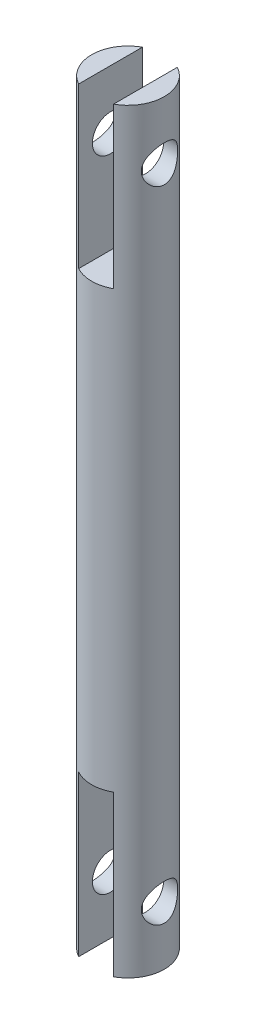
ISO-10303-21;
HEADER;
FILE_DESCRIPTION(('STEP AP214'),'2;1');
FILE_NAME('part.step','',(''),(''),'','','');
FILE_SCHEMA(('AUTOMOTIVE_DESIGN { 1 0 10303 214 1 1 1 1 }'));
ENDSEC;
DATA;
#1=APPLICATION_CONTEXT('core data for automotive mechanical design processes');
#2=APPLICATION_PROTOCOL_DEFINITION('international standard','automotive_design',2000,#1);
#3=PRODUCT_CONTEXT('',#1,'mechanical');
#4=PRODUCT('Part','Part','',(#3));
#5=PRODUCT_RELATED_PRODUCT_CATEGORY('part','',(#4));
#6=PRODUCT_DEFINITION_FORMATION('','',#4);
#7=PRODUCT_DEFINITION_CONTEXT('part definition',#1,'design');
#8=PRODUCT_DEFINITION('design','',#6,#7);
#9=PRODUCT_DEFINITION_SHAPE('','',#8);
#10=(LENGTH_UNIT() NAMED_UNIT(*) SI_UNIT(.MILLI.,.METRE.));
#11=(NAMED_UNIT(*) PLANE_ANGLE_UNIT() SI_UNIT($,.RADIAN.));
#12=(NAMED_UNIT(*) SI_UNIT($,.STERADIAN.) SOLID_ANGLE_UNIT());
#13=UNCERTAINTY_MEASURE_WITH_UNIT(LENGTH_MEASURE(1.E-05),#10,'distance_accuracy_value','');
#14=(GEOMETRIC_REPRESENTATION_CONTEXT(3) GLOBAL_UNCERTAINTY_ASSIGNED_CONTEXT((#13)) GLOBAL_UNIT_ASSIGNED_CONTEXT((#10,
#11,#12)) REPRESENTATION_CONTEXT('',''));
#15=CARTESIAN_POINT('',(0.,0.,0.));
#16=DIRECTION('',(0.,0.,1.));
#17=DIRECTION('',(1.,0.,0.));
#18=AXIS2_PLACEMENT_3D('',#15,#16,#17);
#19=CARTESIAN_POINT('',(0.,52.,0.));
#20=DIRECTION('',(0.,1.,0.));
#21=DIRECTION('',(0.,0.,1.));
#22=AXIS2_PLACEMENT_3D('',#19,#20,#21);
#23=PLANE('',#22);
#24=DIRECTION('',(0.,0.,1.));
#25=VECTOR('',#24,1.);
#26=CARTESIAN_POINT('',(-1.2,52.,-2.5));
#27=LINE('',#26,#25);
#28=CARTESIAN_POINT('',(-1.2,52.,-2.19317121994613));
#29=VERTEX_POINT('',#28);
#30=CARTESIAN_POINT('',(-1.2,52.,2.19317121994613));
#31=VERTEX_POINT('',#30);
#32=EDGE_CURVE('E122',#29,#31,#27,.T.);
#33=ORIENTED_EDGE('',*,*,#32,.F.);
#34=CARTESIAN_POINT('',(0.,52.,0.));
#35=DIRECTION('',(0.,1.,0.));
#36=DIRECTION('',(0.,0.,1.));
#37=AXIS2_PLACEMENT_3D('',#34,#35,#36);
#38=CIRCLE('',#37,2.5);
#39=EDGE_CURVE('E134',#29,#31,#38,.T.);
#40=ORIENTED_EDGE('',*,*,#39,.T.);
#41=EDGE_LOOP('',(#33,#40));
#42=FACE_BOUND('',#41,.T.);
#43=ADVANCED_FACE('F45',(#42),#23,.T.);
#44=CARTESIAN_POINT('',(-2.5,48.,0.));
#45=DIRECTION('',(1.,0.,0.));
#46=DIRECTION('',(0.,0.,-1.));
#47=AXIS2_PLACEMENT_3D('',#44,#45,#46);
#48=CYLINDRICAL_SURFACE('',#47,1.25);
#49=CARTESIAN_POINT('',(-1.2,48.,0.));
#50=DIRECTION('',(-1.,0.,0.));
#51=DIRECTION('',(0.,0.,1.));
#52=AXIS2_PLACEMENT_3D('',#49,#50,#51);
#53=CIRCLE('',#52,1.25);
#54=CARTESIAN_POINT('',(-1.2,48.,1.25));
#55=VERTEX_POINT('',#54);
#56=EDGE_CURVE('E227',#55,#55,#53,.F.);
#57=ORIENTED_EDGE('',*,*,#56,.T.);
#58=EDGE_LOOP('',(#57));
#59=FACE_BOUND('',#58,.T.);
#60=CARTESIAN_POINT('',(-2.5,46.75,0.));
#61=CARTESIAN_POINT('',(-2.49999641755189,46.7500041278994,-0.0657149536912329));
#62=CARTESIAN_POINT('',(-2.49738113774397,46.7552125914021,-0.131508249622541));
#63=CARTESIAN_POINT('',(-2.48717695046745,46.7758161004261,-0.261150294085531));
#64=CARTESIAN_POINT('',(-2.47957859786229,46.7912304912471,-0.324995108391879));
#65=CARTESIAN_POINT('',(-2.46020349254139,46.831492260771,-0.448666931100718));
#66=CARTESIAN_POINT('',(-2.448442989719,46.85630298031,-0.508508503673975));
#67=CARTESIAN_POINT('',(-2.42182220644723,46.9144632767062,-0.623090771008206));
#68=CARTESIAN_POINT('',(-2.40696217041913,46.9478121803111,-0.677831867487562));
#69=CARTESIAN_POINT('',(-2.37445322822571,47.0243965618566,-0.784384772202396));
#70=CARTESIAN_POINT('',(-2.3566899890942,47.0681080990496,-0.835819013902634));
#71=CARTESIAN_POINT('',(-2.32074962808431,47.1631518490588,-0.930974306083716));
#72=CARTESIAN_POINT('',(-2.30257220261294,47.2144898147155,-0.974689478883455));
#73=CARTESIAN_POINT('',(-2.26623688996684,47.3281041869042,-1.05656500056285));
#74=CARTESIAN_POINT('',(-2.24818983712665,47.3909201229324,-1.09403166943955));
#75=CARTESIAN_POINT('',(-2.21607473465401,47.5229591699828,-1.15771028361337));
#76=CARTESIAN_POINT('',(-2.20200384508737,47.5921776609034,-1.18393026870792));
#77=CARTESIAN_POINT('',(-2.18072333797261,47.7308313817774,-1.22266555273573));
#78=CARTESIAN_POINT('',(-2.17315339479642,47.8000055650842,-1.23590732135055));
#79=CARTESIAN_POINT('',(-2.1647736243566,47.9399735472244,-1.25053374163606));
#80=CARTESIAN_POINT('',(-2.1639571167911,48.0107656760889,-1.25193011046634));
#81=CARTESIAN_POINT('',(-2.16888662821561,48.1428575303942,-1.24335910896537));
#82=CARTESIAN_POINT('',(-2.17385954577517,48.2042800390288,-1.23473069942102));
#83=CARTESIAN_POINT('',(-2.18845285917313,48.3246523867163,-1.20867481132116));
#84=CARTESIAN_POINT('',(-2.1980747353972,48.3836014316316,-1.19124452987206));
#85=CARTESIAN_POINT('',(-2.22109345515926,48.4990364157071,-1.1477622254825));
#86=CARTESIAN_POINT('',(-2.23457300829998,48.5554329984822,-1.12151883389499));
#87=CARTESIAN_POINT('',(-2.26379255351755,48.6632928657375,-1.061302109585));
#88=CARTESIAN_POINT('',(-2.27953355975238,48.7147539195001,-1.02732530476558));
#89=CARTESIAN_POINT('',(-2.31391447379107,48.818151565929,-0.947582568640984));
#90=CARTESIAN_POINT('',(-2.33266887795933,48.8693210919702,-0.9008680729616));
#91=CARTESIAN_POINT('',(-2.36934529125509,48.9634192732386,-0.799444473426714));
#92=CARTESIAN_POINT('',(-2.38726689948501,49.0063439900424,-0.744731570717854));
#93=CARTESIAN_POINT('',(-2.42127484103705,49.0846070762872,-0.625645632289809));
#94=CARTESIAN_POINT('',(-2.43723730202509,49.1195005905572,-0.56094198949926));
#95=CARTESIAN_POINT('',(-2.46447351401553,49.1776212863038,-0.425582769360996));
#96=CARTESIAN_POINT('',(-2.47575098679441,49.200857731269,-0.354931970331595));
#97=CARTESIAN_POINT('',(-2.49155417176795,49.2330942546458,-0.215958114575876));
#98=CARTESIAN_POINT('',(-2.4965617287664,49.2431140446835,-0.147926913185405));
#99=CARTESIAN_POINT('',(-2.50091266823877,49.2518309139181,-0.0109744999366913));
#100=CARTESIAN_POINT('',(-2.5002587340164,49.2505333570493,0.0579462748373776));
#101=CARTESIAN_POINT('',(-2.49363990316801,49.2372416394766,0.189041214982493));
#102=CARTESIAN_POINT('',(-2.48809057110237,49.2260843340875,0.251324260062444));
#103=CARTESIAN_POINT('',(-2.47277714143524,49.1947024101311,0.373008615377397));
#104=CARTESIAN_POINT('',(-2.46301257917916,49.1744767919333,0.432409607113746));
#105=CARTESIAN_POINT('',(-2.43980314267087,49.1250019169585,0.548610760562083));
#106=CARTESIAN_POINT('',(-2.42626102212424,49.095511187354,0.605287996257694));
#107=CARTESIAN_POINT('',(-2.39679967896386,49.0286155804424,0.713076702123653));
#108=CARTESIAN_POINT('',(-2.38087944457231,48.9912073317582,0.764185787219102));
#109=CARTESIAN_POINT('',(-2.34635276671831,48.9052994683339,0.864709611613315));
#110=CARTESIAN_POINT('',(-2.32763606060552,48.856071414433,0.913465097280797));
#111=CARTESIAN_POINT('',(-2.29077989504843,48.7500935609134,1.00232040139155));
#112=CARTESIAN_POINT('',(-2.27264084226908,48.6933386014795,1.04241423211355));
#113=CARTESIAN_POINT('',(-2.23813990282585,48.5704454322496,1.11463489312212));
#114=CARTESIAN_POINT('',(-2.2219066207934,48.5039859172393,1.14628186984829));
#115=CARTESIAN_POINT('',(-2.19467590460158,48.3656124153843,1.19760353251725));
#116=CARTESIAN_POINT('',(-2.18367172800773,48.2937055918735,1.21729364485946));
#117=CARTESIAN_POINT('',(-2.16951876260834,48.1538622214232,1.2423271093121));
#118=CARTESIAN_POINT('',(-2.16571729325614,48.0862071832137,1.24886624550108));
#119=CARTESIAN_POINT('',(-2.16456693307719,47.9506911660366,1.25086144297598));
#120=CARTESIAN_POINT('',(-2.16721524534441,47.8828302890757,1.2463223082805));
#121=CARTESIAN_POINT('',(-2.17797327562531,47.755645623085,1.22740765699033));
#122=CARTESIAN_POINT('',(-2.18553868102992,47.6961244123195,1.2140103929285));
#123=CARTESIAN_POINT('',(-2.20463770234897,47.5802398507191,1.1789691977808));
#124=CARTESIAN_POINT('',(-2.21617259462095,47.523877522385,1.15732261394976));
#125=CARTESIAN_POINT('',(-2.2428566295566,47.4117189362667,1.10476968162585));
#126=CARTESIAN_POINT('',(-2.25819652995238,47.3562151227129,1.07333892227057));
#127=CARTESIAN_POINT('',(-2.29044164543238,47.2509068297743,1.00268871454579));
#128=CARTESIAN_POINT('',(-2.30734767243153,47.2011053368519,0.963465214048306));
#129=CARTESIAN_POINT('',(-2.34327903949141,47.102322522053,0.872754158330797));
#130=CARTESIAN_POINT('',(-2.36231229139336,47.0541761220476,0.820355528762708));
#131=CARTESIAN_POINT('',(-2.3984719031886,46.9671712707205,0.707693507775343));
#132=CARTESIAN_POINT('',(-2.4155972326005,46.9283178257171,0.647425904070976));
#133=CARTESIAN_POINT('',(-2.44622511981379,46.8609545465472,0.519914496024928));
#134=CARTESIAN_POINT('',(-2.45970120703636,46.8325197882357,0.452624379918262));
#135=CARTESIAN_POINT('',(-2.48126676704332,46.7877397901013,0.313427626617734));
#136=CARTESIAN_POINT('',(-2.48937154216165,46.771360191463,0.241534749528954));
#137=CARTESIAN_POINT('',(-2.49619327387079,46.7576282361552,0.140752433104227));
#138=CARTESIAN_POINT('',(-2.49761706674002,46.7547716989205,0.112702349299371));
#139=CARTESIAN_POINT('',(-2.49952121222331,46.750956668104,0.0564396647589457));
#140=CARTESIAN_POINT('',(-2.50000153879704,46.749998226911,0.0282270595592261));
#141=CARTESIAN_POINT('',(-2.5,46.75,0.));
#142=B_SPLINE_CURVE_WITH_KNOTS('',3,(#60,#61,#62,#63,#64,#65,#66,#67,#68,#69,#70,#71,#72,#73,
#74,#75,#76,#77,#78,#79,#80,#81,#82,#83,#84,#85,#86,#87,#88,#89,#90,#91,#92,#93,#94,#95,#96,#97,
#98,#99,#100,#101,#102,#103,#104,#105,#106,#107,#108,#109,#110,#111,#112,#113,#114,#115,#116,
#117,#118,#119,#120,#121,#122,#123,#124,#125,#126,#127,#128,#129,#130,#131,#132,#133,#134,#135,
#136,#137,#138,#139,#140,#141),.UNSPECIFIED.,.T.,.F.,(4,2,2,2,2,2,2,2,2,2,2,2,2,2,2,2,2,2,2,2,2,
2,2,2,2,2,2,2,2,2,2,2,2,2,2,2,2,2,2,2,4),(0.,0.197030321775365,0.394435187136497,
0.591077694365375,0.787704700726956,0.9962271983976,1.20490779706754,1.42977158038441,
1.65447434872851,1.86572515175287,2.07676696661275,2.2625714051165,2.44843504907097,
2.63862800210609,2.82890651575277,3.04331176667347,3.25781918248357,3.4822877776805,
3.70657771140349,3.91229113089181,4.11790705639344,4.30758633132651,4.49728652038664,
4.69241070034873,4.88761813435423,5.10199513305522,5.31651985769288,5.54143352699591,
5.76605639925971,5.96911634372966,6.17208824825005,6.35572412805227,6.53941910979597,
6.73545570969517,6.93159451423696,7.15156553440622,7.37165479220715,7.59330017078655,
7.81431135781161,7.8989410017212,7.98357298143557),.UNSPECIFIED.);
#143=CARTESIAN_POINT('',(-2.5,46.75,0.));
#144=VERTEX_POINT('',#143);
#145=EDGE_CURVE('E170',#144,#144,#142,.T.);
#146=ORIENTED_EDGE('',*,*,#145,.F.);
#147=EDGE_LOOP('',(#146));
#148=FACE_BOUND('',#147,.T.);
#149=ADVANCED_FACE('F183',(#59,#148),#48,.F.);
#150=CARTESIAN_POINT('',(0.,52.,0.));
#151=DIRECTION('',(0.,-1.,0.));
#152=DIRECTION('',(0.,0.,-1.));
#153=AXIS2_PLACEMENT_3D('',#150,#151,#152);
#154=CYLINDRICAL_SURFACE('',#153,2.5);
#155=CARTESIAN_POINT('',(0.,41.,0.));
#156=DIRECTION('',(0.,-1.,0.));
#157=DIRECTION('',(0.,0.,-1.));
#158=AXIS2_PLACEMENT_3D('',#155,#156,#157);
#159=CIRCLE('',#158,2.5);
#160=CARTESIAN_POINT('',(1.2,41.,2.19317121994613));
#161=VERTEX_POINT('',#160);
#162=CARTESIAN_POINT('',(-1.2,41.,2.19317121994613));
#163=VERTEX_POINT('',#162);
#164=EDGE_CURVE('E11',#161,#163,#159,.T.);
#165=ORIENTED_EDGE('',*,*,#164,.T.);
#166=DIRECTION('',(0.,-1.,0.));
#167=VECTOR('',#166,1.);
#168=CARTESIAN_POINT('',(-1.2,52.,2.19317121994613));
#169=LINE('',#168,#167);
#170=EDGE_CURVE('E223',#163,#31,#169,.F.);
#171=ORIENTED_EDGE('',*,*,#170,.T.);
#172=ORIENTED_EDGE('',*,*,#39,.F.);
#173=DIRECTION('',(0.,-1.,0.));
#174=VECTOR('',#173,1.);
#175=CARTESIAN_POINT('',(-1.2,52.,-2.19317121994613));
#176=LINE('',#175,#174);
#177=CARTESIAN_POINT('',(-1.2,41.,-2.19317121994613));
#178=VERTEX_POINT('',#177);
#179=EDGE_CURVE('E161',#29,#178,#176,.T.);
#180=ORIENTED_EDGE('',*,*,#179,.T.);
#181=CARTESIAN_POINT('',(1.2,41.,-2.19317121994613));
#182=VERTEX_POINT('',#181);
#183=EDGE_CURVE('E50',#178,#182,#159,.T.);
#184=ORIENTED_EDGE('',*,*,#183,.T.);
#185=DIRECTION('',(0.,-1.,0.));
#186=VECTOR('',#185,1.);
#187=CARTESIAN_POINT('',(1.2,52.,-2.19317121994613));
#188=LINE('',#187,#186);
#189=CARTESIAN_POINT('',(1.2,52.,-2.19317121994613));
#190=VERTEX_POINT('',#189);
#191=EDGE_CURVE('E115',#182,#190,#188,.F.);
#192=ORIENTED_EDGE('',*,*,#191,.T.);
#193=CARTESIAN_POINT('',(1.2,52.,2.19317121994613));
#194=VERTEX_POINT('',#193);
#195=EDGE_CURVE('E126',#194,#190,#38,.T.);
#196=ORIENTED_EDGE('',*,*,#195,.F.);
#197=DIRECTION('',(0.,-1.,0.));
#198=VECTOR('',#197,1.);
#199=CARTESIAN_POINT('',(1.2,52.,2.19317121994613));
#200=LINE('',#199,#198);
#201=EDGE_CURVE('E62',#194,#161,#200,.T.);
#202=ORIENTED_EDGE('',*,*,#201,.T.);
#203=EDGE_LOOP('',(#165,#171,#172,#180,#184,#192,#196,#202));
#204=FACE_BOUND('',#203,.T.);
#205=CARTESIAN_POINT('',(-2.5,2.75,0.));
#206=CARTESIAN_POINT('',(-2.49999641755189,2.75000412789938,-0.0657149536912331));
#207=CARTESIAN_POINT('',(-2.49738113774397,2.75521259140209,-0.131508249622541));
#208=CARTESIAN_POINT('',(-2.48717695046745,2.77581610042615,-0.261150294085532));
#209=CARTESIAN_POINT('',(-2.47957859786229,2.79123049124706,-0.32499510839188));
#210=CARTESIAN_POINT('',(-2.46020349254139,2.83149226077099,-0.448666931100718));
#211=CARTESIAN_POINT('',(-2.448442989719,2.85630298031002,-0.508508503673975));
#212=CARTESIAN_POINT('',(-2.42182220644723,2.91446327670618,-0.623090771008207));
#213=CARTESIAN_POINT('',(-2.40696217041912,2.94781218031107,-0.677831867487563));
#214=CARTESIAN_POINT('',(-2.37445322822571,3.02439656185662,-0.784384772202399));
#215=CARTESIAN_POINT('',(-2.3566899890942,3.06810809904955,-0.835819013902641));
#216=CARTESIAN_POINT('',(-2.3207496280843,3.16315184905879,-0.930974306083722));
#217=CARTESIAN_POINT('',(-2.30257220261294,3.21448981471555,-0.974689478883458));
#218=CARTESIAN_POINT('',(-2.26623688996684,3.32810418690423,-1.05656500056285));
#219=CARTESIAN_POINT('',(-2.24818983712665,3.39092012293239,-1.09403166943955));
#220=CARTESIAN_POINT('',(-2.21607473465401,3.52295916998277,-1.15771028361337));
#221=CARTESIAN_POINT('',(-2.20200384508737,3.59217766090344,-1.18393026870792));
#222=CARTESIAN_POINT('',(-2.18072333797261,3.7308313817774,-1.22266555273573));
#223=CARTESIAN_POINT('',(-2.17315339479642,3.80000556508424,-1.23590732135055));
#224=CARTESIAN_POINT('',(-2.1647736243566,3.93997354722434,-1.25053374163606));
#225=CARTESIAN_POINT('',(-2.1639571167911,4.01076567608894,-1.25193011046634));
#226=CARTESIAN_POINT('',(-2.16888662821561,4.14285753039421,-1.24335910896537));
#227=CARTESIAN_POINT('',(-2.17385954577517,4.20428003902881,-1.23473069942103));
#228=CARTESIAN_POINT('',(-2.18845285917313,4.3246523867163,-1.20867481132117));
#229=CARTESIAN_POINT('',(-2.1980747353972,4.38360143163164,-1.19124452987206));
#230=CARTESIAN_POINT('',(-2.22109345515926,4.49903641570707,-1.1477622254825));
#231=CARTESIAN_POINT('',(-2.23457300829998,4.55543299848223,-1.12151883389499));
#232=CARTESIAN_POINT('',(-2.26379255351755,4.66329286573751,-1.061302109585));
#233=CARTESIAN_POINT('',(-2.27953355975238,4.71475391950011,-1.02732530476558));
#234=CARTESIAN_POINT('',(-2.31391447379107,4.81815156592903,-0.947582568640986));
#235=CARTESIAN_POINT('',(-2.33266887795933,4.8693210919702,-0.900868072961602));
#236=CARTESIAN_POINT('',(-2.36934529125509,4.96341927323863,-0.799444473426716));
#237=CARTESIAN_POINT('',(-2.38726689948501,5.00634399004235,-0.744731570717856));
#238=CARTESIAN_POINT('',(-2.42127484103705,5.08460707628716,-0.625645632289809));
#239=CARTESIAN_POINT('',(-2.43723730202509,5.11950059055718,-0.56094198949926));
#240=CARTESIAN_POINT('',(-2.46447351401553,5.17762128630376,-0.425582769360995));
#241=CARTESIAN_POINT('',(-2.47575098679441,5.20085773126896,-0.354931970331594));
#242=CARTESIAN_POINT('',(-2.49155417176795,5.23309425464584,-0.215958114575876));
#243=CARTESIAN_POINT('',(-2.4965617287664,5.24311404468347,-0.147926913185404));
#244=CARTESIAN_POINT('',(-2.50091266823877,5.25183091391811,-0.0109744999366911));
#245=CARTESIAN_POINT('',(-2.5002587340164,5.25053335704935,0.0579462748373775));
#246=CARTESIAN_POINT('',(-2.49363990316801,5.23724163947656,0.189041214982492));
#247=CARTESIAN_POINT('',(-2.48809057110237,5.22608433408746,0.251324260062443));
#248=CARTESIAN_POINT('',(-2.47277714143524,5.19470241013114,0.373008615377396));
#249=CARTESIAN_POINT('',(-2.46301257917916,5.1744767919333,0.432409607113746));
#250=CARTESIAN_POINT('',(-2.43980314267087,5.12500191695853,0.548610760562081));
#251=CARTESIAN_POINT('',(-2.42626102212424,5.09551118735398,0.605287996257691));
#252=CARTESIAN_POINT('',(-2.39679967896386,5.02861558044245,0.71307670212365));
#253=CARTESIAN_POINT('',(-2.38087944457231,4.99120733175821,0.764185787219102));
#254=CARTESIAN_POINT('',(-2.34635276671831,4.90529946833391,0.864709611613316));
#255=CARTESIAN_POINT('',(-2.32763606060552,4.85607141443304,0.913465097280798));
#256=CARTESIAN_POINT('',(-2.29077989504843,4.75009356091337,1.00232040139155));
#257=CARTESIAN_POINT('',(-2.27264084226908,4.69333860147953,1.04241423211355));
#258=CARTESIAN_POINT('',(-2.23813990282585,4.57044543224961,1.11463489312212));
#259=CARTESIAN_POINT('',(-2.2219066207934,4.50398591723926,1.1462818698483));
#260=CARTESIAN_POINT('',(-2.19467590460158,4.36561241538435,1.19760353251725));
#261=CARTESIAN_POINT('',(-2.18367172800773,4.29370559187352,1.21729364485946));
#262=CARTESIAN_POINT('',(-2.16951876260833,4.15386222142319,1.2423271093121));
#263=CARTESIAN_POINT('',(-2.16571729325614,4.0862071832137,1.24886624550108));
#264=CARTESIAN_POINT('',(-2.16456693307719,3.95069116603659,1.25086144297598));
#265=CARTESIAN_POINT('',(-2.16721524534441,3.88283028907571,1.2463223082805));
#266=CARTESIAN_POINT('',(-2.17797327562531,3.75564562308498,1.22740765699033));
#267=CARTESIAN_POINT('',(-2.18553868102992,3.6961244123195,1.2140103929285));
#268=CARTESIAN_POINT('',(-2.20463770234897,3.58023985071912,1.17896919778081));
#269=CARTESIAN_POINT('',(-2.21617259462095,3.52387752238504,1.15732261394976));
#270=CARTESIAN_POINT('',(-2.2428566295566,3.41171893626674,1.10476968162585));
#271=CARTESIAN_POINT('',(-2.25819652995238,3.35621512271287,1.07333892227057));
#272=CARTESIAN_POINT('',(-2.29044164543238,3.25090682977427,1.00268871454579));
#273=CARTESIAN_POINT('',(-2.30734767243153,3.20110533685189,0.963465214048309));
#274=CARTESIAN_POINT('',(-2.34327903949141,3.10232252205298,0.8727541583308));
#275=CARTESIAN_POINT('',(-2.36231229139336,3.0541761220476,0.820355528762712));
#276=CARTESIAN_POINT('',(-2.3984719031886,2.96717127072046,0.707693507775348));
#277=CARTESIAN_POINT('',(-2.4155972326005,2.92831782571714,0.64742590407098));
#278=CARTESIAN_POINT('',(-2.44622511981379,2.86095454654725,0.519914496024933));
#279=CARTESIAN_POINT('',(-2.45970120703636,2.83251978823571,0.452624379918268));
#280=CARTESIAN_POINT('',(-2.48126676704332,2.78773979010131,0.313427626617739));
#281=CARTESIAN_POINT('',(-2.48937154216165,2.77136019146303,0.241534749528957));
#282=CARTESIAN_POINT('',(-2.49619327387079,2.75762823615519,0.140752433104229));
#283=CARTESIAN_POINT('',(-2.49761706674002,2.75477169892048,0.112702349299373));
#284=CARTESIAN_POINT('',(-2.49952121222331,2.75095666810399,0.0564396647589469));
#285=CARTESIAN_POINT('',(-2.50000153879704,2.749998226911,0.0282270595592267));
#286=CARTESIAN_POINT('',(-2.5,2.75,0.));
#287=B_SPLINE_CURVE_WITH_KNOTS('',3,(#205,#206,#207,#208,#209,#210,#211,#212,#213,#214,#215,
#216,#217,#218,#219,#220,#221,#222,#223,#224,#225,#226,#227,#228,#229,#230,#231,#232,#233,#234,
#235,#236,#237,#238,#239,#240,#241,#242,#243,#244,#245,#246,#247,#248,#249,#250,#251,#252,#253,
#254,#255,#256,#257,#258,#259,#260,#261,#262,#263,#264,#265,#266,#267,#268,#269,#270,#271,#272,
#273,#274,#275,#276,#277,#278,#279,#280,#281,#282,#283,#284,#285,#286),.UNSPECIFIED.,.T.,.F.,(4,
2,2,2,2,2,2,2,2,2,2,2,2,2,2,2,2,2,2,2,2,2,2,2,2,2,2,2,2,2,2,2,2,2,2,2,2,2,2,2,4),(0.,
0.197030321775366,0.394435187136497,0.591077694365373,0.78770470072696,0.996227198397612,
1.20490779706755,1.42977158038441,1.65447434872851,1.86572515175287,2.07676696661275,
2.2625714051165,2.44843504907098,2.63862800210609,2.82890651575277,3.04331176667348,
3.25781918248358,3.48228777768051,3.70657771140349,3.91229113089182,4.11790705639345,
4.30758633132652,4.49728652038664,4.69241070034873,4.88761813435424,5.10199513305523,
5.31651985769289,5.54143352699592,5.76605639925972,5.96911634372967,6.17208824825007,
6.35572412805228,6.53941910979597,6.73545570969517,6.93159451423697,7.15156553440623,
7.37165479220716,7.59330017078656,7.81431135781162,7.89894100172122,7.98357298143558),.UNSPECIFIED.);
#288=CARTESIAN_POINT('',(-2.5,2.75,0.));
#289=VERTEX_POINT('',#288);
#290=EDGE_CURVE('E245',#289,#289,#287,.T.);
#291=ORIENTED_EDGE('',*,*,#290,.T.);
#292=EDGE_LOOP('',(#291));
#293=FACE_BOUND('',#292,.T.);
#294=CARTESIAN_POINT('',(2.1650635094611,4.,-1.25));
#295=CARTESIAN_POINT('',(2.16506918410574,3.93486523975594,-1.24999545384316));
#296=CARTESIAN_POINT('',(2.16804751484696,3.86964823559369,-1.24487496341652));
#297=CARTESIAN_POINT('',(2.17952958065066,3.74121591915356,-1.22465401237257));
#298=CARTESIAN_POINT('',(2.18804492569449,3.67800510619574,-1.20953258069272));
#299=CARTESIAN_POINT('',(2.20936683256748,3.55568541957007,-1.17012493587476));
#300=CARTESIAN_POINT('',(2.22215054341565,3.49655668440802,-1.14588744061716));
#301=CARTESIAN_POINT('',(2.25053331021072,3.3832197475041,-1.08908440672047));
#302=CARTESIAN_POINT('',(2.26613251845081,3.32901181217193,-1.05651841754472));
#303=CARTESIAN_POINT('',(2.29996086321802,3.22211783930312,-0.980833175663599));
#304=CARTESIAN_POINT('',(2.31830079547442,3.16992608040807,-0.937065045179714));
#305=CARTESIAN_POINT('',(2.35464978482132,3.07323951449162,-0.841567259518087));
#306=CARTESIAN_POINT('',(2.37265867289062,3.0287485467706,-0.789833657227868));
#307=CARTESIAN_POINT('',(2.40776846191186,2.94579106106542,-0.675611954268185));
#308=CARTESIAN_POINT('',(2.42472633022716,2.90793279017559,-0.612633986265721));
#309=CARTESIAN_POINT('',(2.45438445124411,2.8435739334428,-0.480196283249383));
#310=CARTESIAN_POINT('',(2.46708738979677,2.81706617982854,-0.410740672672698));
#311=CARTESIAN_POINT('',(2.48600576555297,2.77811917337363,-0.272556179907475));
#312=CARTESIAN_POINT('',(2.49261850276115,2.76481309205559,-0.204127238111026));
#313=CARTESIAN_POINT('',(2.50009479807584,2.7497923516562,-0.0657132858723139));
#314=CARTESIAN_POINT('',(2.50096183480737,2.74807067900536,0.00427075730466945));
#315=CARTESIAN_POINT('',(2.49703727395563,2.75593334246294,0.137290655529684));
#316=CARTESIAN_POINT('',(2.49273119865201,2.76454751940153,0.200401498970986));
#317=CARTESIAN_POINT('',(2.47967806574684,2.79110105488082,0.3241422148979));
#318=CARTESIAN_POINT('',(2.47093067582992,2.80904111122028,0.384771901367404));
#319=CARTESIAN_POINT('',(2.44964479109568,2.85385320761227,0.50288673946194));
#320=CARTESIAN_POINT('',(2.43705551911499,2.88084539146508,0.560316779393971));
#321=CARTESIAN_POINT('',(2.40922057483359,2.94282927025187,0.669971001891658));
#322=CARTESIAN_POINT('',(2.39397395196855,2.97782382912794,0.722193311048305));
#323=CARTESIAN_POINT('',(2.36055492999037,3.05861918941627,0.825217076122742));
#324=CARTESIAN_POINT('',(2.34224219997719,3.10512878540751,0.875417593786699));
#325=CARTESIAN_POINT('',(2.30567925733515,3.20573715616272,0.967630462872223));
#326=CARTESIAN_POINT('',(2.28742910332036,3.25984171534258,1.00963651446779));
#327=CARTESIAN_POINT('',(2.25180195115606,3.37831024053011,1.08688166830276));
#328=CARTESIAN_POINT('',(2.23455399988385,3.44310752881776,1.12152164372256));
#329=CARTESIAN_POINT('',(2.2046931284822,3.57867208919875,1.17914889125154));
#330=CARTESIAN_POINT('',(2.19207537557584,3.64943304127195,1.20214832276361));
#331=CARTESIAN_POINT('',(2.17430794771293,3.78901813910349,1.2339752637813));
#332=CARTESIAN_POINT('',(2.16864569810621,3.85755139880444,1.24378140264997));
#333=CARTESIAN_POINT('',(2.16397399202012,3.99550167689567,1.25189618326428));
#334=CARTESIAN_POINT('',(2.1649598361164,4.06491803639973,1.25021294664378));
#335=CARTESIAN_POINT('',(2.17292920675731,4.19456739822341,1.23629505417996));
#336=CARTESIAN_POINT('',(2.17924484383318,4.2549743138849,1.22523477089058));
#337=CARTESIAN_POINT('',(2.19617526939176,4.37295973283869,1.19462035579055));
#338=CARTESIAN_POINT('',(2.20679145006292,4.43053731343326,1.17506347327952));
#339=CARTESIAN_POINT('',(2.23170277599571,4.54426416362837,1.12705948575611));
#340=CARTESIAN_POINT('',(2.24614554053829,4.60022377106694,1.09824257961591));
#341=CARTESIAN_POINT('',(2.27695149371562,4.70683658942374,1.03285883001976));
#342=CARTESIAN_POINT('',(2.29331566693934,4.7574870543916,0.996288005415272));
#343=CARTESIAN_POINT('',(2.3285999807042,4.85872345940443,0.911046458998569));
#344=CARTESIAN_POINT('',(2.34758228942861,4.90849643839707,0.86143159039371));
#345=CARTESIAN_POINT('',(2.38417793722366,4.99926529749199,0.754255619247862));
#346=CARTESIAN_POINT('',(2.40179081259637,5.04025821278817,0.696691843319186));
#347=CARTESIAN_POINT('',(2.43426702113696,5.11321715743763,0.573169203198449));
#348=CARTESIAN_POINT('',(2.44904552090036,5.14491639776364,0.507028871967643));
#349=CARTESIAN_POINT('',(2.47354193699126,5.19642237982174,0.369402955801354));
#350=CARTESIAN_POINT('',(2.48326429595466,5.21623956420788,0.297922126740222));
#351=CARTESIAN_POINT('',(2.49584385227353,5.24171070521833,0.158724602913023));
#352=CARTESIAN_POINT('',(2.49924909885239,5.24849734484514,0.0912643048130729));
#353=CARTESIAN_POINT('',(2.50052662968914,5.251054081818,-0.0439074824390028));
#354=CARTESIAN_POINT('',(2.49840085083612,5.24682803565445,-0.111618875368857));
#355=CARTESIAN_POINT('',(2.48917461047403,5.22822949150547,-0.240672490396432));
#356=CARTESIAN_POINT('',(2.48241118334987,5.21454393842791,-0.302140397264078));
#357=CARTESIAN_POINT('',(2.46490117079279,5.17834125087129,-0.42180744022952));
#358=CARTESIAN_POINT('',(2.45415401415995,5.15582284988318,-0.480006106194384));
#359=CARTESIAN_POINT('',(2.4290741343515,5.10159118479253,-0.594279257806103));
#360=CARTESIAN_POINT('',(2.41460771498499,5.0695258459902,-0.650156428375055));
#361=CARTESIAN_POINT('',(2.38360166427283,4.99755258642619,-0.755968302267528));
#362=CARTESIAN_POINT('',(2.36706108197951,4.95764106360541,-0.805900259268631));
#363=CARTESIAN_POINT('',(2.33160762783285,4.86650357622162,-0.903642505196111));
#364=CARTESIAN_POINT('',(2.31262248764623,4.81454689065351,-0.950747105674087));
#365=CARTESIAN_POINT('',(2.27578845203566,4.70318659858779,-1.03582910924334));
#366=CARTESIAN_POINT('',(2.25794057202332,4.6437764739154,-1.07379843751257));
#367=CARTESIAN_POINT('',(2.22499506631145,4.51670419177381,-1.14053884973207));
#368=CARTESIAN_POINT('',(2.21000217820338,4.44884058608908,-1.16898133245117));
#369=CARTESIAN_POINT('',(2.1858269541044,4.30833449457528,-1.21359838688301));
#370=CARTESIAN_POINT('',(2.17662520184628,4.23570888885914,-1.22981398896918));
#371=CARTESIAN_POINT('',(2.16911590752238,4.13524330543501,-1.24295875983052));
#372=CARTESIAN_POINT('',(2.1676016125644,4.10829013200265,-1.24559513120481));
#373=CARTESIAN_POINT('',(2.16557419859688,4.0542293991472,-1.24911675636245));
#374=CARTESIAN_POINT('',(2.16506114656387,4.02712182951766,-1.25000189299984));
#375=CARTESIAN_POINT('',(2.1650635094611,4.,-1.25));
#376=B_SPLINE_CURVE_WITH_KNOTS('',3,(#294,#295,#296,#297,#298,#299,#300,#301,#302,#303,#304,
#305,#306,#307,#308,#309,#310,#311,#312,#313,#314,#315,#316,#317,#318,#319,#320,#321,#322,#323,
#324,#325,#326,#327,#328,#329,#330,#331,#332,#333,#334,#335,#336,#337,#338,#339,#340,#341,#342,
#343,#344,#345,#346,#347,#348,#349,#350,#351,#352,#353,#354,#355,#356,#357,#358,#359,#360,#361,
#362,#363,#364,#365,#366,#367,#368,#369,#370,#371,#372,#373,#374,#375),.UNSPECIFIED.,.T.,.F.,(4,
2,2,2,2,2,2,2,2,2,2,2,2,2,2,2,2,2,2,2,2,2,2,2,2,2,2,2,2,2,2,2,2,2,2,2,2,2,2,2,4),(0.,
0.195290153243394,0.390991116031005,0.585660744898606,0.780340906806435,0.991077890622789,
1.20191963855463,1.42697365298454,1.65188533704863,1.86079356209918,2.0695752960755,
2.26020121855672,2.45084140646818,2.64411918413933,2.83746624187839,3.04908989321113,
3.26087560307398,3.4861105216181,3.71110967764631,3.91827863567764,4.12530116485466,
4.30967729280031,4.49411315545078,4.68709120507609,4.88016857775058,5.09758429475766,
5.31507331222752,5.53830226766206,5.76133474760964,5.96390337986858,6.16640108492464,
6.35555531089365,6.54473666890015,6.74200938399339,6.93937287625898,7.15637802312583,
7.37357428556442,7.59763436298255,7.8209391625345,7.90225168981636,7.98356965618175),.UNSPECIFIED.);
#377=CARTESIAN_POINT('',(2.1650635094611,4.,-1.25));
#378=VERTEX_POINT('',#377);
#379=EDGE_CURVE('E238',#378,#378,#376,.T.);
#380=ORIENTED_EDGE('',*,*,#379,.T.);
#381=EDGE_LOOP('',(#380));
#382=FACE_BOUND('',#381,.T.);
#383=ORIENTED_EDGE('',*,*,#145,.T.);
#384=EDGE_LOOP('',(#383));
#385=FACE_BOUND('',#384,.T.);
#386=CARTESIAN_POINT('',(2.1650635094611,48.,-1.25));
#387=CARTESIAN_POINT('',(2.16506918410574,47.9348652397559,-1.24999545384316));
#388=CARTESIAN_POINT('',(2.16804751484696,47.8696482355937,-1.24487496341652));
#389=CARTESIAN_POINT('',(2.17952958065066,47.7412159191536,-1.22465401237257));
#390=CARTESIAN_POINT('',(2.18804492569449,47.6780051061957,-1.20953258069272));
#391=CARTESIAN_POINT('',(2.20936683256748,47.5556854195701,-1.17012493587476));
#392=CARTESIAN_POINT('',(2.22215054341565,47.496556684408,-1.14588744061716));
#393=CARTESIAN_POINT('',(2.25053331021072,47.3832197475041,-1.08908440672046));
#394=CARTESIAN_POINT('',(2.26613251845081,47.3290118121719,-1.05651841754471));
#395=CARTESIAN_POINT('',(2.29996086321802,47.2221178393031,-0.980833175663595));
#396=CARTESIAN_POINT('',(2.31830079547442,47.1699260804081,-0.93706504517971));
#397=CARTESIAN_POINT('',(2.35464978482132,47.0732395144916,-0.841567259518083));
#398=CARTESIAN_POINT('',(2.37265867289062,47.0287485467706,-0.789833657227865));
#399=CARTESIAN_POINT('',(2.40776846191186,46.9457910610654,-0.675611954268183));
#400=CARTESIAN_POINT('',(2.42472633022716,46.9079327901756,-0.61263398626572));
#401=CARTESIAN_POINT('',(2.45438445124411,46.8435739334428,-0.480196283249383));
#402=CARTESIAN_POINT('',(2.46708738979677,46.8170661798285,-0.410740672672697));
#403=CARTESIAN_POINT('',(2.48600576555297,46.7781191733736,-0.272556179907475));
#404=CARTESIAN_POINT('',(2.49261850276115,46.7648130920556,-0.204127238111025));
#405=CARTESIAN_POINT('',(2.50009479807584,46.7497923516562,-0.0657132858723139));
#406=CARTESIAN_POINT('',(2.50096183480737,46.7480706790054,0.00427075730466915));
#407=CARTESIAN_POINT('',(2.49703727395563,46.7559333424629,0.137290655529684));
#408=CARTESIAN_POINT('',(2.49273119865201,46.7645475194015,0.200401498970986));
#409=CARTESIAN_POINT('',(2.47967806574684,46.7911010548808,0.3241422148979));
#410=CARTESIAN_POINT('',(2.47093067582992,46.8090411112203,0.384771901367404));
#411=CARTESIAN_POINT('',(2.44964479109568,46.8538532076123,0.502886739461939));
#412=CARTESIAN_POINT('',(2.43705551911499,46.8808453914651,0.56031677939397));
#413=CARTESIAN_POINT('',(2.40922057483359,46.9428292702519,0.669971001891658));
#414=CARTESIAN_POINT('',(2.39397395196855,46.9778238291279,0.722193311048306));
#415=CARTESIAN_POINT('',(2.36055492999037,47.0586191894163,0.825217076122743));
#416=CARTESIAN_POINT('',(2.34224219997719,47.1051287854075,0.875417593786699));
#417=CARTESIAN_POINT('',(2.30567925733515,47.2057371561627,0.967630462872223));
#418=CARTESIAN_POINT('',(2.28742910332036,47.2598417153426,1.00963651446779));
#419=CARTESIAN_POINT('',(2.25180195115606,47.3783102405301,1.08688166830276));
#420=CARTESIAN_POINT('',(2.23455399988384,47.4431075288178,1.12152164372256));
#421=CARTESIAN_POINT('',(2.2046931284822,47.5786720891987,1.17914889125154));
#422=CARTESIAN_POINT('',(2.19207537557584,47.649433041272,1.20214832276361));
#423=CARTESIAN_POINT('',(2.17430794771293,47.7890181391035,1.2339752637813));
#424=CARTESIAN_POINT('',(2.16864569810621,47.8575513988044,1.24378140264997));
#425=CARTESIAN_POINT('',(2.16397399202012,47.9955016768957,1.25189618326428));
#426=CARTESIAN_POINT('',(2.1649598361164,48.0649180363997,1.25021294664378));
#427=CARTESIAN_POINT('',(2.17292920675731,48.1945673982234,1.23629505417996));
#428=CARTESIAN_POINT('',(2.17924484383318,48.2549743138849,1.22523477089058));
#429=CARTESIAN_POINT('',(2.19617526939176,48.3729597328387,1.19462035579055));
#430=CARTESIAN_POINT('',(2.20679145006292,48.4305373134333,1.17506347327952));
#431=CARTESIAN_POINT('',(2.23170277599571,48.5442641636284,1.12705948575611));
#432=CARTESIAN_POINT('',(2.24614554053829,48.6002237710669,1.0982425796159));
#433=CARTESIAN_POINT('',(2.27695149371562,48.7068365894237,1.03285883001976));
#434=CARTESIAN_POINT('',(2.29331566693934,48.7574870543916,0.996288005415271));
#435=CARTESIAN_POINT('',(2.3285999807042,48.8587234594044,0.911046458998568));
#436=CARTESIAN_POINT('',(2.34758228942861,48.9084964383971,0.86143159039371));
#437=CARTESIAN_POINT('',(2.38417793722365,48.999265297492,0.754255619247864));
#438=CARTESIAN_POINT('',(2.40179081259636,49.0402582127882,0.696691843319187));
#439=CARTESIAN_POINT('',(2.43426702113696,49.1132171574376,0.57316920319845));
#440=CARTESIAN_POINT('',(2.44904552090036,49.1449163977636,0.507028871967644));
#441=CARTESIAN_POINT('',(2.47354193699126,49.1964223798217,0.369402955801354));
#442=CARTESIAN_POINT('',(2.48326429595466,49.2162395642079,0.29792212674022));
#443=CARTESIAN_POINT('',(2.49584385227353,49.2417107052183,0.158724602913021));
#444=CARTESIAN_POINT('',(2.49924909885239,49.2484973448451,0.0912643048130715));
#445=CARTESIAN_POINT('',(2.50052662968914,49.251054081818,-0.0439074824390033));
#446=CARTESIAN_POINT('',(2.49840085083612,49.2468280356545,-0.111618875368857));
#447=CARTESIAN_POINT('',(2.48917461047403,49.2282294915055,-0.240672490396431));
#448=CARTESIAN_POINT('',(2.48241118334987,49.2145439384279,-0.302140397264077));
#449=CARTESIAN_POINT('',(2.46490117079279,49.1783412508713,-0.421807440229519));
#450=CARTESIAN_POINT('',(2.45415401415995,49.1558228498832,-0.480006106194384));
#451=CARTESIAN_POINT('',(2.4290741343515,49.1015911847925,-0.594279257806104));
#452=CARTESIAN_POINT('',(2.41460771498499,49.0695258459902,-0.650156428375056));
#453=CARTESIAN_POINT('',(2.38360166427283,48.9975525864262,-0.75596830226753));
#454=CARTESIAN_POINT('',(2.36706108197951,48.9576410636054,-0.805900259268633));
#455=CARTESIAN_POINT('',(2.33160762783285,48.8665035762216,-0.903642505196114));
#456=CARTESIAN_POINT('',(2.31262248764622,48.8145468906535,-0.95074710567409));
#457=CARTESIAN_POINT('',(2.27578845203565,48.7031865985878,-1.03582910924334));
#458=CARTESIAN_POINT('',(2.25794057202332,48.6437764739154,-1.07379843751257));
#459=CARTESIAN_POINT('',(2.22499506631145,48.5167041917738,-1.14053884973207));
#460=CARTESIAN_POINT('',(2.21000217820338,48.4488405860891,-1.16898133245117));
#461=CARTESIAN_POINT('',(2.1858269541044,48.3083344945753,-1.21359838688301));
#462=CARTESIAN_POINT('',(2.17662520184628,48.2357088888591,-1.22981398896918));
#463=CARTESIAN_POINT('',(2.16911590752238,48.135243305435,-1.24295875983052));
#464=CARTESIAN_POINT('',(2.1676016125644,48.1082901320026,-1.24559513120481));
#465=CARTESIAN_POINT('',(2.16557419859688,48.0542293991472,-1.24911675636245));
#466=CARTESIAN_POINT('',(2.16506114656387,48.0271218295177,-1.25000189299984));
#467=CARTESIAN_POINT('',(2.1650635094611,48.,-1.25));
#468=B_SPLINE_CURVE_WITH_KNOTS('',3,(#386,#387,#388,#389,#390,#391,#392,#393,#394,#395,#396,
#397,#398,#399,#400,#401,#402,#403,#404,#405,#406,#407,#408,#409,#410,#411,#412,#413,#414,#415,
#416,#417,#418,#419,#420,#421,#422,#423,#424,#425,#426,#427,#428,#429,#430,#431,#432,#433,#434,
#435,#436,#437,#438,#439,#440,#441,#442,#443,#444,#445,#446,#447,#448,#449,#450,#451,#452,#453,
#454,#455,#456,#457,#458,#459,#460,#461,#462,#463,#464,#465,#466,#467),.UNSPECIFIED.,.T.,.F.,(4,
2,2,2,2,2,2,2,2,2,2,2,2,2,2,2,2,2,2,2,2,2,2,2,2,2,2,2,2,2,2,2,2,2,2,2,2,2,2,2,4),(0.,
0.195290153243387,0.390991116031004,0.585660744898612,0.780340906806441,0.991077890622794,
1.20191963855463,1.42697365298454,1.65188533704863,1.86079356209918,2.06957529607549,
2.26020121855672,2.45084140646818,2.64411918413933,2.83746624187839,3.04908989321113,
3.26087560307398,3.4861105216181,3.71110967764631,3.91827863567763,4.12530116485465,
4.30967729280031,4.49411315545078,4.68709120507608,4.88016857775058,5.09758429475765,
5.31507331222751,5.53830226766206,5.76133474760963,5.96390337986857,6.16640108492463,
6.35555531089364,6.54473666890015,6.74200938399339,6.93937287625898,7.15637802312583,
7.37357428556441,7.59763436298255,7.82093916253449,7.90225168981636,7.98356965618174),.UNSPECIFIED.);
#469=CARTESIAN_POINT('',(2.1650635094611,48.,-1.25));
#470=VERTEX_POINT('',#469);
#471=EDGE_CURVE('E162',#470,#470,#468,.T.);
#472=ORIENTED_EDGE('',*,*,#471,.T.);
#473=EDGE_LOOP('',(#472));
#474=FACE_BOUND('',#473,.T.);
#475=DIRECTION('',(0.,-1.,0.));
#476=VECTOR('',#475,1.);
#477=CARTESIAN_POINT('',(-1.2,52.,2.19317121994613));
#478=LINE('',#477,#476);
#479=CARTESIAN_POINT('',(-1.2,11.,2.19317121994613));
#480=VERTEX_POINT('',#479);
#481=CARTESIAN_POINT('',(-1.2,0.,2.19317121994613));
#482=VERTEX_POINT('',#481);
#483=EDGE_CURVE('E144',#480,#482,#478,.T.);
#484=ORIENTED_EDGE('',*,*,#483,.F.);
#485=CARTESIAN_POINT('',(0.,11.,0.));
#486=DIRECTION('',(0.,-1.,0.));
#487=DIRECTION('',(0.,0.,-1.));
#488=AXIS2_PLACEMENT_3D('',#485,#486,#487);
#489=CIRCLE('',#488,2.5);
#490=CARTESIAN_POINT('',(1.2,11.,2.19317121994613));
#491=VERTEX_POINT('',#490);
#492=EDGE_CURVE('E155',#491,#480,#489,.T.);
#493=ORIENTED_EDGE('',*,*,#492,.F.);
#494=DIRECTION('',(0.,-1.,0.));
#495=VECTOR('',#494,1.);
#496=CARTESIAN_POINT('',(1.2,52.,2.19317121994613));
#497=LINE('',#496,#495);
#498=CARTESIAN_POINT('',(1.2,0.,2.19317121994613));
#499=VERTEX_POINT('',#498);
#500=EDGE_CURVE('E262',#491,#499,#497,.T.);
#501=ORIENTED_EDGE('',*,*,#500,.T.);
#502=CARTESIAN_POINT('',(0.,0.,0.));
#503=DIRECTION('',(0.,1.,0.));
#504=DIRECTION('',(0.,0.,1.));
#505=AXIS2_PLACEMENT_3D('',#502,#503,#504);
#506=CIRCLE('',#505,2.5);
#507=CARTESIAN_POINT('',(1.2,0.,-2.19317121994613));
#508=VERTEX_POINT('',#507);
#509=EDGE_CURVE('E141',#499,#508,#506,.T.);
#510=ORIENTED_EDGE('',*,*,#509,.T.);
#511=DIRECTION('',(0.,-1.,0.));
#512=VECTOR('',#511,1.);
#513=CARTESIAN_POINT('',(1.2,52.,-2.19317121994613));
#514=LINE('',#513,#512);
#515=CARTESIAN_POINT('',(1.2,11.,-2.19317121994613));
#516=VERTEX_POINT('',#515);
#517=EDGE_CURVE('E70',#508,#516,#514,.F.);
#518=ORIENTED_EDGE('',*,*,#517,.T.);
#519=CARTESIAN_POINT('',(-1.2,11.,-2.19317121994613));
#520=VERTEX_POINT('',#519);
#521=EDGE_CURVE('E152',#520,#516,#489,.T.);
#522=ORIENTED_EDGE('',*,*,#521,.F.);
#523=DIRECTION('',(0.,-1.,0.));
#524=VECTOR('',#523,1.);
#525=CARTESIAN_POINT('',(-1.2,52.,-2.19317121994613));
#526=LINE('',#525,#524);
#527=CARTESIAN_POINT('',(-1.2,0.,-2.19317121994613));
#528=VERTEX_POINT('',#527);
#529=EDGE_CURVE('E265',#528,#520,#526,.F.);
#530=ORIENTED_EDGE('',*,*,#529,.F.);
#531=EDGE_CURVE('E146',#528,#482,#506,.T.);
#532=ORIENTED_EDGE('',*,*,#531,.T.);
#533=EDGE_LOOP('',(#484,#493,#501,#510,#518,#522,#530,#532));
#534=FACE_BOUND('',#533,.T.);
#535=ADVANCED_FACE('F47',(#204,#293,#382,#385,#474,#534),#154,.T.);
#536=CARTESIAN_POINT('',(0.,0.,0.));
#537=DIRECTION('',(0.,1.,0.));
#538=DIRECTION('',(0.,0.,1.));
#539=AXIS2_PLACEMENT_3D('',#536,#537,#538);
#540=PLANE('',#539);
#541=DIRECTION('',(0.,0.,-1.));
#542=VECTOR('',#541,1.);
#543=CARTESIAN_POINT('',(-1.2,0.,0.));
#544=LINE('',#543,#542);
#545=EDGE_CURVE('E138',#482,#528,#544,.T.);
#546=ORIENTED_EDGE('',*,*,#545,.F.);
#547=ORIENTED_EDGE('',*,*,#531,.F.);
#548=EDGE_LOOP('',(#546,#547));
#549=FACE_BOUND('',#548,.T.);
#550=ADVANCED_FACE('F202',(#549),#540,.F.);
#551=DIRECTION('',(0.,0.,-1.));
#552=VECTOR('',#551,1.);
#553=CARTESIAN_POINT('',(1.2,52.,-2.5));
#554=LINE('',#553,#552);
#555=EDGE_CURVE('E112',#194,#190,#554,.T.);
#556=ORIENTED_EDGE('',*,*,#555,.F.);
#557=ORIENTED_EDGE('',*,*,#195,.T.);
#558=EDGE_LOOP('',(#556,#557));
#559=FACE_BOUND('',#558,.T.);
#560=ADVANCED_FACE('F131',(#559),#23,.T.);
#561=ORIENTED_EDGE('',*,*,#509,.F.);
#562=DIRECTION('',(0.,0.,-1.));
#563=VECTOR('',#562,1.);
#564=CARTESIAN_POINT('',(1.2,0.,0.));
#565=LINE('',#564,#563);
#566=EDGE_CURVE('E133',#499,#508,#565,.T.);
#567=ORIENTED_EDGE('',*,*,#566,.T.);
#568=EDGE_LOOP('',(#561,#567));
#569=FACE_BOUND('',#568,.T.);
#570=ADVANCED_FACE('F191',(#569),#540,.F.);
#571=CARTESIAN_POINT('',(0.,11.,0.));
#572=DIRECTION('',(0.,-1.,0.));
#573=DIRECTION('',(0.,0.,-1.));
#574=AXIS2_PLACEMENT_3D('',#571,#572,#573);
#575=PLANE('',#574);
#576=DIRECTION('',(0.,0.,1.));
#577=VECTOR('',#576,1.);
#578=CARTESIAN_POINT('',(1.2,11.,-2.5));
#579=LINE('',#578,#577);
#580=EDGE_CURVE('E252',#516,#491,#579,.T.);
#581=ORIENTED_EDGE('',*,*,#580,.T.);
#582=ORIENTED_EDGE('',*,*,#492,.T.);
#583=DIRECTION('',(0.,0.,1.));
#584=VECTOR('',#583,1.);
#585=CARTESIAN_POINT('',(-1.2,11.,-2.5));
#586=LINE('',#585,#584);
#587=EDGE_CURVE('E256',#520,#480,#586,.T.);
#588=ORIENTED_EDGE('',*,*,#587,.F.);
#589=ORIENTED_EDGE('',*,*,#521,.T.);
#590=EDGE_LOOP('',(#581,#582,#588,#589));
#591=FACE_BOUND('',#590,.T.);
#592=ADVANCED_FACE('F186',(#591),#575,.T.);
#593=CARTESIAN_POINT('',(-1.2,11.,-2.5));
#594=DIRECTION('',(1.,0.,0.));
#595=DIRECTION('',(0.,0.,-1.));
#596=AXIS2_PLACEMENT_3D('',#593,#594,#595);
#597=PLANE('',#596);
#598=CARTESIAN_POINT('',(-1.2,4.,0.));
#599=DIRECTION('',(1.,0.,0.));
#600=DIRECTION('',(0.,0.,-1.));
#601=AXIS2_PLACEMENT_3D('',#598,#599,#600);
#602=CIRCLE('',#601,1.25);
#603=CARTESIAN_POINT('',(-1.2,4.,-1.25));
#604=VERTEX_POINT('',#603);
#605=EDGE_CURVE('E160',#604,#604,#602,.T.);
#606=ORIENTED_EDGE('',*,*,#605,.F.);
#607=EDGE_LOOP('',(#606));
#608=FACE_BOUND('',#607,.T.);
#609=ORIENTED_EDGE('',*,*,#483,.T.);
#610=ORIENTED_EDGE('',*,*,#545,.T.);
#611=ORIENTED_EDGE('',*,*,#529,.T.);
#612=ORIENTED_EDGE('',*,*,#587,.T.);
#613=EDGE_LOOP('',(#609,#610,#611,#612));
#614=FACE_BOUND('',#613,.T.);
#615=ADVANCED_FACE('F190',(#608,#614),#597,.T.);
#616=CARTESIAN_POINT('',(1.2,11.,-2.5));
#617=DIRECTION('',(1.,0.,0.));
#618=DIRECTION('',(0.,0.,-1.));
#619=AXIS2_PLACEMENT_3D('',#616,#617,#618);
#620=PLANE('',#619);
#621=CARTESIAN_POINT('',(1.2,4.,0.));
#622=DIRECTION('',(1.,0.,0.));
#623=DIRECTION('',(0.,0.,-1.));
#624=AXIS2_PLACEMENT_3D('',#621,#622,#623);
#625=CIRCLE('',#624,1.25);
#626=CARTESIAN_POINT('',(1.2,4.,-1.25));
#627=VERTEX_POINT('',#626);
#628=EDGE_CURVE('E156',#627,#627,#625,.T.);
#629=ORIENTED_EDGE('',*,*,#628,.T.);
#630=EDGE_LOOP('',(#629));
#631=FACE_BOUND('',#630,.T.);
#632=ORIENTED_EDGE('',*,*,#580,.F.);
#633=ORIENTED_EDGE('',*,*,#517,.F.);
#634=ORIENTED_EDGE('',*,*,#566,.F.);
#635=ORIENTED_EDGE('',*,*,#500,.F.);
#636=EDGE_LOOP('',(#632,#633,#634,#635));
#637=FACE_BOUND('',#636,.T.);
#638=ADVANCED_FACE('F195',(#631,#637),#620,.F.);
#639=CARTESIAN_POINT('',(-2.5,4.,0.));
#640=DIRECTION('',(1.,0.,0.));
#641=DIRECTION('',(0.,0.,-1.));
#642=AXIS2_PLACEMENT_3D('',#639,#640,#641);
#643=CYLINDRICAL_SURFACE('',#642,1.25);
#644=ORIENTED_EDGE('',*,*,#628,.F.);
#645=EDGE_LOOP('',(#644));
#646=FACE_BOUND('',#645,.T.);
#647=ORIENTED_EDGE('',*,*,#379,.F.);
#648=EDGE_LOOP('',(#647));
#649=FACE_BOUND('',#648,.T.);
#650=ADVANCED_FACE('F199',(#646,#649),#643,.F.);
#651=ORIENTED_EDGE('',*,*,#605,.T.);
#652=EDGE_LOOP('',(#651));
#653=FACE_BOUND('',#652,.T.);
#654=ORIENTED_EDGE('',*,*,#290,.F.);
#655=EDGE_LOOP('',(#654));
#656=FACE_BOUND('',#655,.T.);
#657=ADVANCED_FACE('F181',(#653,#656),#643,.F.);
#658=CARTESIAN_POINT('',(1.2,48.,0.));
#659=DIRECTION('',(1.,0.,0.));
#660=DIRECTION('',(0.,0.,-1.));
#661=AXIS2_PLACEMENT_3D('',#658,#659,#660);
#662=CIRCLE('',#661,1.25);
#663=CARTESIAN_POINT('',(1.2,48.,-1.25));
#664=VERTEX_POINT('',#663);
#665=EDGE_CURVE('E129',#664,#664,#662,.F.);
#666=ORIENTED_EDGE('',*,*,#665,.T.);
#667=EDGE_LOOP('',(#666));
#668=FACE_BOUND('',#667,.T.);
#669=ORIENTED_EDGE('',*,*,#471,.F.);
#670=EDGE_LOOP('',(#669));
#671=FACE_BOUND('',#670,.T.);
#672=ADVANCED_FACE('F175',(#668,#671),#48,.F.);
#673=CARTESIAN_POINT('',(0.,41.,0.));
#674=DIRECTION('',(0.,-1.,0.));
#675=DIRECTION('',(0.,0.,-1.));
#676=AXIS2_PLACEMENT_3D('',#673,#674,#675);
#677=PLANE('',#676);
#678=DIRECTION('',(0.,0.,-1.));
#679=VECTOR('',#678,1.);
#680=CARTESIAN_POINT('',(1.2,41.,-2.5));
#681=LINE('',#680,#679);
#682=EDGE_CURVE('E398',#161,#182,#681,.T.);
#683=ORIENTED_EDGE('',*,*,#682,.T.);
#684=ORIENTED_EDGE('',*,*,#183,.F.);
#685=DIRECTION('',(0.,0.,1.));
#686=VECTOR('',#685,1.);
#687=CARTESIAN_POINT('',(-1.2,41.,-2.5));
#688=LINE('',#687,#686);
#689=EDGE_CURVE('E121',#178,#163,#688,.T.);
#690=ORIENTED_EDGE('',*,*,#689,.T.);
#691=ORIENTED_EDGE('',*,*,#164,.F.);
#692=EDGE_LOOP('',(#683,#684,#690,#691));
#693=FACE_BOUND('',#692,.T.);
#694=ADVANCED_FACE('F180',(#693),#677,.F.);
#695=CARTESIAN_POINT('',(-1.2,41.,-2.5));
#696=DIRECTION('',(-1.,0.,0.));
#697=DIRECTION('',(0.,0.,1.));
#698=AXIS2_PLACEMENT_3D('',#695,#696,#697);
#699=PLANE('',#698);
#700=ORIENTED_EDGE('',*,*,#56,.F.);
#701=EDGE_LOOP('',(#700));
#702=FACE_BOUND('',#701,.T.);
#703=ORIENTED_EDGE('',*,*,#32,.T.);
#704=ORIENTED_EDGE('',*,*,#170,.F.);
#705=ORIENTED_EDGE('',*,*,#689,.F.);
#706=ORIENTED_EDGE('',*,*,#179,.F.);
#707=EDGE_LOOP('',(#703,#704,#705,#706));
#708=FACE_BOUND('',#707,.T.);
#709=ADVANCED_FACE('F315',(#702,#708),#699,.F.);
#710=CARTESIAN_POINT('',(1.2,41.,-2.5));
#711=DIRECTION('',(1.,0.,0.));
#712=DIRECTION('',(0.,0.,-1.));
#713=AXIS2_PLACEMENT_3D('',#710,#711,#712);
#714=PLANE('',#713);
#715=ORIENTED_EDGE('',*,*,#665,.F.);
#716=EDGE_LOOP('',(#715));
#717=FACE_BOUND('',#716,.T.);
#718=ORIENTED_EDGE('',*,*,#555,.T.);
#719=ORIENTED_EDGE('',*,*,#191,.F.);
#720=ORIENTED_EDGE('',*,*,#682,.F.);
#721=ORIENTED_EDGE('',*,*,#201,.F.);
#722=EDGE_LOOP('',(#718,#719,#720,#721));
#723=FACE_BOUND('',#722,.T.);
#724=ADVANCED_FACE('F114',(#717,#723),#714,.F.);
#725=CLOSED_SHELL('',(#43,#149,#535,#550,#560,#570,#592,#615,#638,#650,#657,#672,#694,#709,#724));
#726=MANIFOLD_SOLID_BREP('B2',#725);
#727=ADVANCED_BREP_SHAPE_REPRESENTATION('',(#18,#726),#14);
#728=SHAPE_DEFINITION_REPRESENTATION(#9,#727);
ENDSEC;
END-ISO-10303-21;
